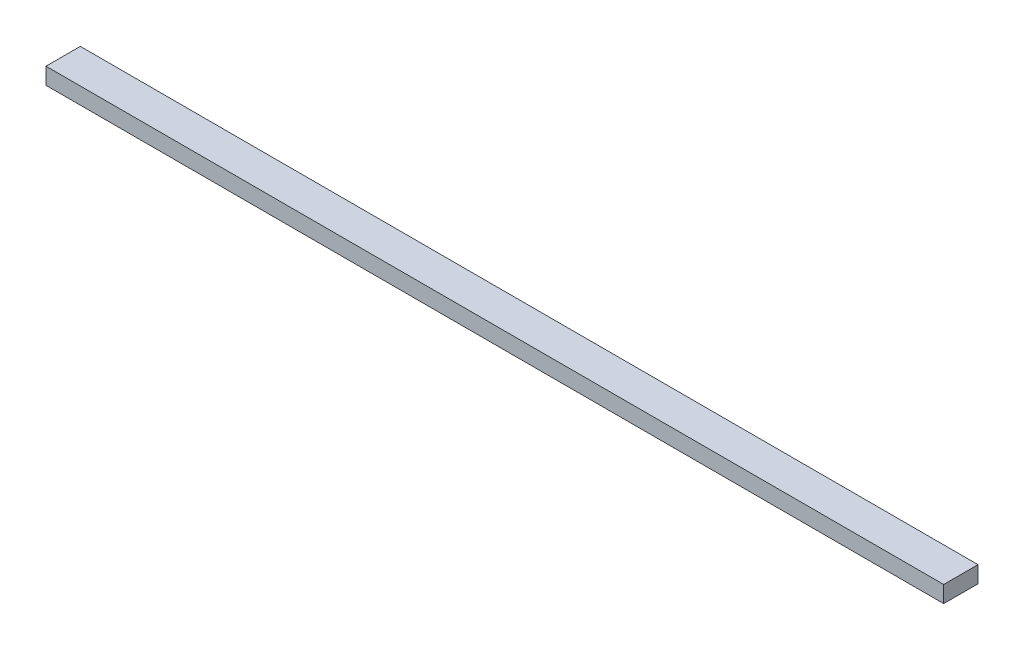
ISO-10303-21;
HEADER;
FILE_DESCRIPTION(('STEP AP214'),'2;1');
FILE_NAME('part.step','',(''),(''),'','','');
FILE_SCHEMA(('AUTOMOTIVE_DESIGN { 1 0 10303 214 1 1 1 1 }'));
ENDSEC;
DATA;
#1=APPLICATION_CONTEXT('core data for automotive mechanical design processes');
#2=APPLICATION_PROTOCOL_DEFINITION('international standard','automotive_design',2000,#1);
#3=PRODUCT_CONTEXT('',#1,'mechanical');
#4=PRODUCT('Part','Part','',(#3));
#5=PRODUCT_RELATED_PRODUCT_CATEGORY('part','',(#4));
#6=PRODUCT_DEFINITION_FORMATION('','',#4);
#7=PRODUCT_DEFINITION_CONTEXT('part definition',#1,'design');
#8=PRODUCT_DEFINITION('design','',#6,#7);
#9=PRODUCT_DEFINITION_SHAPE('','',#8);
#10=(LENGTH_UNIT() NAMED_UNIT(*) SI_UNIT(.MILLI.,.METRE.));
#11=(NAMED_UNIT(*) PLANE_ANGLE_UNIT() SI_UNIT($,.RADIAN.));
#12=(NAMED_UNIT(*) SI_UNIT($,.STERADIAN.) SOLID_ANGLE_UNIT());
#13=UNCERTAINTY_MEASURE_WITH_UNIT(LENGTH_MEASURE(1.E-05),#10,'distance_accuracy_value','');
#14=(GEOMETRIC_REPRESENTATION_CONTEXT(3) GLOBAL_UNCERTAINTY_ASSIGNED_CONTEXT((#13)) GLOBAL_UNIT_ASSIGNED_CONTEXT((#10,
#11,#12)) REPRESENTATION_CONTEXT('',''));
#15=CARTESIAN_POINT('',(0.,0.,0.));
#16=DIRECTION('',(0.,0.,1.));
#17=DIRECTION('',(1.,0.,0.));
#18=AXIS2_PLACEMENT_3D('',#15,#16,#17);
#19=CARTESIAN_POINT('',(153.,90.598580894201,15.7358245192997));
#20=DIRECTION('',(0.,0.,-1.));
#21=DIRECTION('',(0.,1.,0.));
#22=AXIS2_PLACEMENT_3D('',#19,#20,#21);
#23=PLANE('',#22);
#24=DIRECTION('',(0.,-1.,0.));
#25=VECTOR('',#24,1.);
#26=CARTESIAN_POINT('',(0.,90.598580894201,15.7358245192997));
#27=LINE('',#26,#25);
#28=CARTESIAN_POINT('',(0.,90.598580894201,15.7358245192997));
#29=VERTEX_POINT('',#28);
#30=CARTESIAN_POINT('',(0.,87.7678967573061,15.7358245192997));
#31=VERTEX_POINT('',#30);
#32=EDGE_CURVE('E98',#29,#31,#27,.T.);
#33=ORIENTED_EDGE('',*,*,#32,.T.);
#34=DIRECTION('',(-1.,0.,0.));
#35=VECTOR('',#34,1.);
#36=CARTESIAN_POINT('',(153.,87.7678967573061,15.7358245192997));
#37=LINE('',#36,#35);
#38=CARTESIAN_POINT('',(153.,87.7678967573061,15.7358245192997));
#39=VERTEX_POINT('',#38);
#40=EDGE_CURVE('E11',#39,#31,#37,.T.);
#41=ORIENTED_EDGE('',*,*,#40,.F.);
#42=DIRECTION('',(0.,-1.,0.));
#43=VECTOR('',#42,1.);
#44=CARTESIAN_POINT('',(153.,90.598580894201,15.7358245192997));
#45=LINE('',#44,#43);
#46=CARTESIAN_POINT('',(153.,90.598580894201,15.7358245192997));
#47=VERTEX_POINT('',#46);
#48=EDGE_CURVE('E86',#47,#39,#45,.T.);
#49=ORIENTED_EDGE('',*,*,#48,.F.);
#50=DIRECTION('',(-1.,0.,0.));
#51=VECTOR('',#50,1.);
#52=CARTESIAN_POINT('',(153.,90.598580894201,15.7358245192997));
#53=LINE('',#52,#51);
#54=EDGE_CURVE('E94',#47,#29,#53,.T.);
#55=ORIENTED_EDGE('',*,*,#54,.T.);
#56=EDGE_LOOP('',(#33,#41,#49,#55));
#57=FACE_BOUND('',#56,.T.);
#58=ADVANCED_FACE('F35',(#57),#23,.F.);
#59=CARTESIAN_POINT('',(153.,87.7678967573061,15.7358245192997));
#60=DIRECTION('',(0.,1.,0.));
#61=DIRECTION('',(0.,0.,1.));
#62=AXIS2_PLACEMENT_3D('',#59,#60,#61);
#63=PLANE('',#62);
#64=DIRECTION('',(0.,0.,-1.));
#65=VECTOR('',#64,1.);
#66=CARTESIAN_POINT('',(0.,87.7678967573061,15.7358245192997));
#67=LINE('',#66,#65);
#68=CARTESIAN_POINT('',(0.,87.7678967573061,9.88676440006222));
#69=VERTEX_POINT('',#68);
#70=EDGE_CURVE('E90',#31,#69,#67,.T.);
#71=ORIENTED_EDGE('',*,*,#70,.T.);
#72=DIRECTION('',(-1.,0.,0.));
#73=VECTOR('',#72,1.);
#74=CARTESIAN_POINT('',(153.,87.7678967573061,9.88676440006222));
#75=LINE('',#74,#73);
#76=CARTESIAN_POINT('',(153.,87.7678967573061,9.88676440006222));
#77=VERTEX_POINT('',#76);
#78=EDGE_CURVE('E43',#77,#69,#75,.T.);
#79=ORIENTED_EDGE('',*,*,#78,.F.);
#80=DIRECTION('',(0.,0.,-1.));
#81=VECTOR('',#80,1.);
#82=CARTESIAN_POINT('',(153.,87.7678967573061,15.7358245192997));
#83=LINE('',#82,#81);
#84=EDGE_CURVE('E81',#39,#77,#83,.T.);
#85=ORIENTED_EDGE('',*,*,#84,.F.);
#86=ORIENTED_EDGE('',*,*,#40,.T.);
#87=EDGE_LOOP('',(#71,#79,#85,#86));
#88=FACE_BOUND('',#87,.T.);
#89=ADVANCED_FACE('F89',(#88),#63,.F.);
#90=CARTESIAN_POINT('',(153.,90.598580894201,9.88676440006222));
#91=DIRECTION('',(0.,0.,1.));
#92=DIRECTION('',(1.,0.,0.));
#93=AXIS2_PLACEMENT_3D('',#90,#91,#92);
#94=PLANE('',#93);
#95=DIRECTION('',(0.,1.,0.));
#96=VECTOR('',#95,1.);
#97=CARTESIAN_POINT('',(0.,90.598580894201,9.88676440006222));
#98=LINE('',#97,#96);
#99=CARTESIAN_POINT('',(0.,90.598580894201,9.88676440006222));
#100=VERTEX_POINT('',#99);
#101=EDGE_CURVE('E68',#69,#100,#98,.T.);
#102=ORIENTED_EDGE('',*,*,#101,.T.);
#103=DIRECTION('',(-1.,0.,0.));
#104=VECTOR('',#103,1.);
#105=CARTESIAN_POINT('',(153.,90.598580894201,9.88676440006222));
#106=LINE('',#105,#104);
#107=CARTESIAN_POINT('',(153.,90.598580894201,9.88676440006222));
#108=VERTEX_POINT('',#107);
#109=EDGE_CURVE('E91',#108,#100,#106,.T.);
#110=ORIENTED_EDGE('',*,*,#109,.F.);
#111=DIRECTION('',(0.,1.,0.));
#112=VECTOR('',#111,1.);
#113=CARTESIAN_POINT('',(153.,90.598580894201,9.88676440006222));
#114=LINE('',#113,#112);
#115=EDGE_CURVE('E84',#77,#108,#114,.T.);
#116=ORIENTED_EDGE('',*,*,#115,.F.);
#117=ORIENTED_EDGE('',*,*,#78,.T.);
#118=EDGE_LOOP('',(#102,#110,#116,#117));
#119=FACE_BOUND('',#118,.T.);
#120=ADVANCED_FACE('F92',(#119),#94,.F.);
#121=CARTESIAN_POINT('',(153.,90.598580894201,15.7358245192997));
#122=DIRECTION('',(0.,-1.,0.));
#123=DIRECTION('',(0.,0.,-1.));
#124=AXIS2_PLACEMENT_3D('',#121,#122,#123);
#125=PLANE('',#124);
#126=DIRECTION('',(0.,0.,1.));
#127=VECTOR('',#126,1.);
#128=CARTESIAN_POINT('',(0.,90.598580894201,15.7358245192997));
#129=LINE('',#128,#127);
#130=EDGE_CURVE('E74',#100,#29,#129,.T.);
#131=ORIENTED_EDGE('',*,*,#130,.T.);
#132=ORIENTED_EDGE('',*,*,#54,.F.);
#133=DIRECTION('',(0.,0.,1.));
#134=VECTOR('',#133,1.);
#135=CARTESIAN_POINT('',(153.,90.598580894201,15.7358245192997));
#136=LINE('',#135,#134);
#137=EDGE_CURVE('E51',#108,#47,#136,.T.);
#138=ORIENTED_EDGE('',*,*,#137,.F.);
#139=ORIENTED_EDGE('',*,*,#109,.T.);
#140=EDGE_LOOP('',(#131,#132,#138,#139));
#141=FACE_BOUND('',#140,.T.);
#142=ADVANCED_FACE('F105',(#141),#125,.F.);
#143=CARTESIAN_POINT('',(153.,0.,0.));
#144=DIRECTION('',(1.,0.,0.));
#145=DIRECTION('',(0.,0.,-1.));
#146=AXIS2_PLACEMENT_3D('',#143,#144,#145);
#147=PLANE('',#146);
#148=ORIENTED_EDGE('',*,*,#48,.T.);
#149=ORIENTED_EDGE('',*,*,#84,.T.);
#150=ORIENTED_EDGE('',*,*,#115,.T.);
#151=ORIENTED_EDGE('',*,*,#137,.T.);
#152=EDGE_LOOP('',(#148,#149,#150,#151));
#153=FACE_BOUND('',#152,.T.);
#154=ADVANCED_FACE('F82',(#153),#147,.T.);
#155=CARTESIAN_POINT('',(0.,0.,0.));
#156=DIRECTION('',(1.,0.,0.));
#157=DIRECTION('',(0.,0.,-1.));
#158=AXIS2_PLACEMENT_3D('',#155,#156,#157);
#159=PLANE('',#158);
#160=ORIENTED_EDGE('',*,*,#32,.F.);
#161=ORIENTED_EDGE('',*,*,#130,.F.);
#162=ORIENTED_EDGE('',*,*,#101,.F.);
#163=ORIENTED_EDGE('',*,*,#70,.F.);
#164=EDGE_LOOP('',(#160,#161,#162,#163));
#165=FACE_BOUND('',#164,.T.);
#166=ADVANCED_FACE('F108',(#165),#159,.F.);
#167=CLOSED_SHELL('',(#58,#89,#120,#142,#154,#166));
#168=MANIFOLD_SOLID_BREP('B2',#167);
#169=ADVANCED_BREP_SHAPE_REPRESENTATION('',(#18,#168),#14);
#170=SHAPE_DEFINITION_REPRESENTATION(#9,#169);
ENDSEC;
END-ISO-10303-21;
